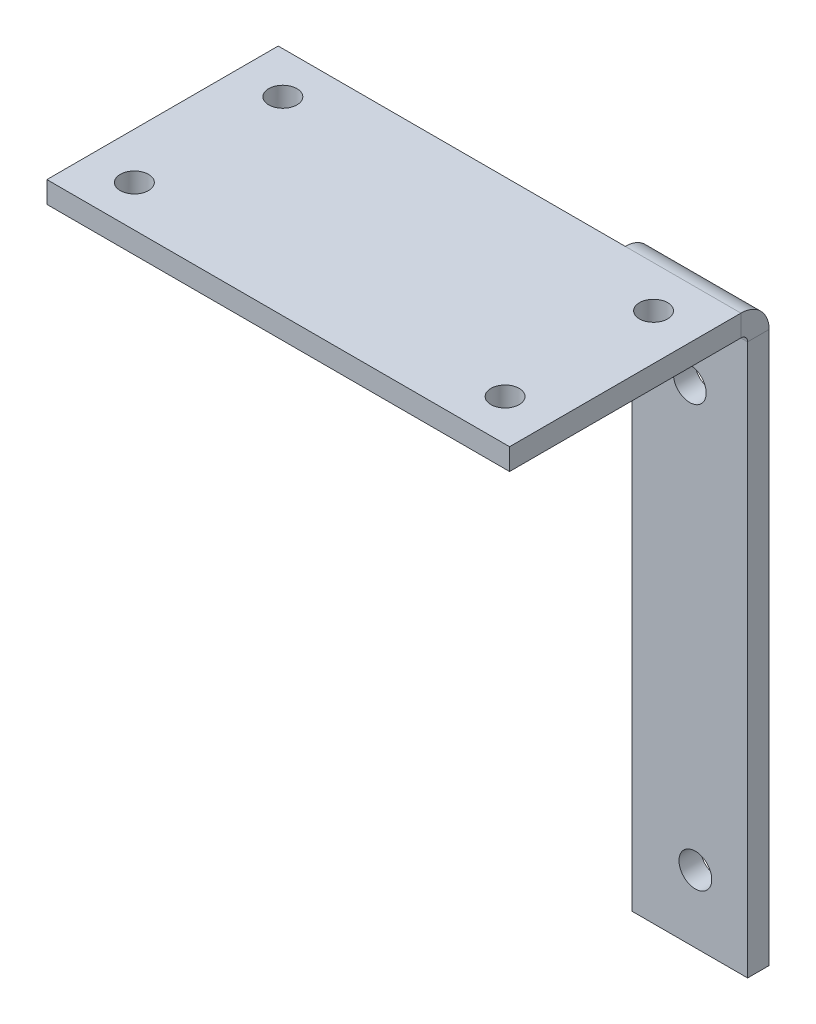
ISO-10303-21;
HEADER;
FILE_DESCRIPTION(('STEP AP214'),'2;1');
FILE_NAME('part.step','',(''),(''),'','','');
FILE_SCHEMA(('AUTOMOTIVE_DESIGN { 1 0 10303 214 1 1 1 1 }'));
ENDSEC;
DATA;
#1=APPLICATION_CONTEXT('core data for automotive mechanical design processes');
#2=APPLICATION_PROTOCOL_DEFINITION('international standard','automotive_design',2000,#1);
#3=PRODUCT_CONTEXT('',#1,'mechanical');
#4=PRODUCT('Part','Part','',(#3));
#5=PRODUCT_RELATED_PRODUCT_CATEGORY('part','',(#4));
#6=PRODUCT_DEFINITION_FORMATION('','',#4);
#7=PRODUCT_DEFINITION_CONTEXT('part definition',#1,'design');
#8=PRODUCT_DEFINITION('design','',#6,#7);
#9=PRODUCT_DEFINITION_SHAPE('','',#8);
#10=(LENGTH_UNIT() NAMED_UNIT(*) SI_UNIT(.MILLI.,.METRE.));
#11=(NAMED_UNIT(*) PLANE_ANGLE_UNIT() SI_UNIT($,.RADIAN.));
#12=(NAMED_UNIT(*) SI_UNIT($,.STERADIAN.) SOLID_ANGLE_UNIT());
#13=UNCERTAINTY_MEASURE_WITH_UNIT(LENGTH_MEASURE(1.E-05),#10,'distance_accuracy_value','');
#14=(GEOMETRIC_REPRESENTATION_CONTEXT(3) GLOBAL_UNCERTAINTY_ASSIGNED_CONTEXT((#13)) GLOBAL_UNIT_ASSIGNED_CONTEXT((#10,
#11,#12)) REPRESENTATION_CONTEXT('',''));
#15=CARTESIAN_POINT('',(0.,0.,0.));
#16=DIRECTION('',(0.,0.,1.));
#17=DIRECTION('',(1.,0.,0.));
#18=AXIS2_PLACEMENT_3D('',#15,#16,#17);
#19=CARTESIAN_POINT('',(0.,25.3135161158946,-28.4988000000001));
#20=DIRECTION('',(0.,0.,1.));
#21=DIRECTION('',(0.,-1.,0.));
#22=AXIS2_PLACEMENT_3D('',#19,#20,#21);
#23=PLANE('',#22);
#24=CARTESIAN_POINT('',(44.45,-10.2464838841054,-28.4988));
#25=DIRECTION('',(0.,0.,-1.));
#26=DIRECTION('',(0.,1.,0.));
#27=AXIS2_PLACEMENT_3D('',#24,#25,#26);
#28=CIRCLE('',#27,1.79958999999999);
#29=CARTESIAN_POINT('',(44.45,-8.44689388410543,-28.4988));
#30=VERTEX_POINT('',#29);
#31=EDGE_CURVE('E166',#30,#30,#28,.T.);
#32=ORIENTED_EDGE('',*,*,#31,.F.);
#33=EDGE_LOOP('',(#32));
#34=FACE_BOUND('',#33,.T.);
#35=CARTESIAN_POINT('',(45.06468,-56.1900038841054,-28.4987999999998));
#36=DIRECTION('',(0.,0.,-1.));
#37=DIRECTION('',(0.,1.,0.));
#38=AXIS2_PLACEMENT_3D('',#35,#36,#37);
#39=CIRCLE('',#38,1.79958999999999);
#40=CARTESIAN_POINT('',(45.06468,-54.3904138841054,-28.4987999999998));
#41=VERTEX_POINT('',#40);
#42=EDGE_CURVE('E165',#41,#41,#39,.T.);
#43=ORIENTED_EDGE('',*,*,#42,.F.);
#44=EDGE_LOOP('',(#43));
#45=FACE_BOUND('',#44,.T.);
#46=DIRECTION('',(0.,1.,0.));
#47=VECTOR('',#46,1.);
#48=CARTESIAN_POINT('',(38.1,-0.0864838841054295,-28.4988));
#49=LINE('',#48,#47);
#50=CARTESIAN_POINT('',(38.1,-63.5864838841054,-28.4987999999998));
#51=VERTEX_POINT('',#50);
#52=CARTESIAN_POINT('',(38.1,-3.09880000000001,-28.4988));
#53=VERTEX_POINT('',#52);
#54=EDGE_CURVE('E60',#51,#53,#49,.T.);
#55=ORIENTED_EDGE('',*,*,#54,.T.);
#56=DIRECTION('',(1.,0.,0.));
#57=VECTOR('',#56,1.);
#58=CARTESIAN_POINT('',(0.,-3.09880000000001,-28.4988));
#59=LINE('',#58,#57);
#60=CARTESIAN_POINT('',(50.8,-3.09880000000001,-28.4988));
#61=VERTEX_POINT('',#60);
#62=EDGE_CURVE('E52',#53,#61,#59,.T.);
#63=ORIENTED_EDGE('',*,*,#62,.T.);
#64=DIRECTION('',(0.,-1.,0.));
#65=VECTOR('',#64,1.);
#66=CARTESIAN_POINT('',(50.8,-63.5864838841054,-28.4987999999998));
#67=LINE('',#66,#65);
#68=CARTESIAN_POINT('',(50.8,-63.5864838841054,-28.4987999999998));
#69=VERTEX_POINT('',#68);
#70=EDGE_CURVE('E68',#61,#69,#67,.T.);
#71=ORIENTED_EDGE('',*,*,#70,.T.);
#72=DIRECTION('',(-1.,0.,0.));
#73=VECTOR('',#72,1.);
#74=CARTESIAN_POINT('',(50.8,-63.5864838841054,-28.4987999999998));
#75=LINE('',#74,#73);
#76=EDGE_CURVE('E178',#69,#51,#75,.T.);
#77=ORIENTED_EDGE('',*,*,#76,.T.);
#78=EDGE_LOOP('',(#55,#63,#71,#77));
#79=FACE_BOUND('',#78,.T.);
#80=ADVANCED_FACE('F43',(#34,#45,#79),#23,.F.);
#81=CARTESIAN_POINT('',(38.1,-0.0864838841054226,-26.1366));
#82=DIRECTION('',(-1.,0.,0.));
#83=DIRECTION('',(0.,1.,0.));
#84=AXIS2_PLACEMENT_3D('',#81,#82,#83);
#85=PLANE('',#84);
#86=DIRECTION('',(0.,0.,1.));
#87=VECTOR('',#86,1.);
#88=CARTESIAN_POINT('',(38.1,-3.0988,-26.1366));
#89=LINE('',#88,#87);
#90=CARTESIAN_POINT('',(38.1,-3.0988,-26.1366));
#91=VERTEX_POINT('',#90);
#92=EDGE_CURVE('E12',#53,#91,#89,.T.);
#93=ORIENTED_EDGE('',*,*,#92,.F.);
#94=ORIENTED_EDGE('',*,*,#54,.F.);
#95=DIRECTION('',(0.,0.,-1.));
#96=VECTOR('',#95,1.);
#97=CARTESIAN_POINT('',(38.1,-63.5864838841054,-26.1365999999998));
#98=LINE('',#97,#96);
#99=CARTESIAN_POINT('',(38.1,-63.5864838841054,-26.1365999999998));
#100=VERTEX_POINT('',#99);
#101=EDGE_CURVE('E180',#100,#51,#98,.T.);
#102=ORIENTED_EDGE('',*,*,#101,.F.);
#103=DIRECTION('',(0.,1.,0.));
#104=VECTOR('',#103,1.);
#105=CARTESIAN_POINT('',(38.1,-0.0864838841054226,-26.1366));
#106=LINE('',#105,#104);
#107=EDGE_CURVE('E177',#100,#91,#106,.T.);
#108=ORIENTED_EDGE('',*,*,#107,.T.);
#109=EDGE_LOOP('',(#93,#94,#102,#108));
#110=FACE_BOUND('',#109,.T.);
#111=ADVANCED_FACE('F45',(#110),#85,.T.);
#112=CARTESIAN_POINT('',(50.8,-63.5864838841054,-26.1365999999998));
#113=DIRECTION('',(0.,-1.,0.));
#114=DIRECTION('',(-1.,0.,0.));
#115=AXIS2_PLACEMENT_3D('',#112,#113,#114);
#116=PLANE('',#115);
#117=ORIENTED_EDGE('',*,*,#76,.F.);
#118=DIRECTION('',(0.,0.,-1.));
#119=VECTOR('',#118,1.);
#120=CARTESIAN_POINT('',(50.8,-63.5864838841054,-26.1365999999998));
#121=LINE('',#120,#119);
#122=CARTESIAN_POINT('',(50.8,-63.5864838841054,-26.1365999999998));
#123=VERTEX_POINT('',#122);
#124=EDGE_CURVE('E183',#123,#69,#121,.T.);
#125=ORIENTED_EDGE('',*,*,#124,.F.);
#126=DIRECTION('',(-1.,0.,0.));
#127=VECTOR('',#126,1.);
#128=CARTESIAN_POINT('',(50.8,-63.5864838841054,-26.1365999999998));
#129=LINE('',#128,#127);
#130=EDGE_CURVE('E174',#123,#100,#129,.T.);
#131=ORIENTED_EDGE('',*,*,#130,.T.);
#132=ORIENTED_EDGE('',*,*,#101,.T.);
#133=EDGE_LOOP('',(#117,#125,#131,#132));
#134=FACE_BOUND('',#133,.T.);
#135=ADVANCED_FACE('F199',(#134),#116,.T.);
#136=CARTESIAN_POINT('',(50.8,-63.5864838841054,-26.1365999999998));
#137=DIRECTION('',(1.,0.,0.));
#138=DIRECTION('',(0.,-1.,0.));
#139=AXIS2_PLACEMENT_3D('',#136,#137,#138);
#140=PLANE('',#139);
#141=DIRECTION('',(0.,0.,-1.));
#142=VECTOR('',#141,1.);
#143=CARTESIAN_POINT('',(50.8,-3.0988,-26.1366));
#144=LINE('',#143,#142);
#145=CARTESIAN_POINT('',(50.8,-3.0988,-26.1366));
#146=VERTEX_POINT('',#145);
#147=EDGE_CURVE('E186',#146,#61,#144,.T.);
#148=ORIENTED_EDGE('',*,*,#147,.F.);
#149=DIRECTION('',(0.,-1.,0.));
#150=VECTOR('',#149,1.);
#151=CARTESIAN_POINT('',(50.8,-63.5864838841054,-26.1365999999998));
#152=LINE('',#151,#150);
#153=EDGE_CURVE('E47',#146,#123,#152,.T.);
#154=ORIENTED_EDGE('',*,*,#153,.T.);
#155=ORIENTED_EDGE('',*,*,#124,.T.);
#156=ORIENTED_EDGE('',*,*,#70,.F.);
#157=EDGE_LOOP('',(#148,#154,#155,#156));
#158=FACE_BOUND('',#157,.T.);
#159=ADVANCED_FACE('F194',(#158),#140,.T.);
#160=CARTESIAN_POINT('',(0.,25.3135161158946,-26.1366000000001));
#161=DIRECTION('',(0.,0.,1.));
#162=DIRECTION('',(0.,-1.,0.));
#163=AXIS2_PLACEMENT_3D('',#160,#161,#162);
#164=PLANE('',#163);
#165=DIRECTION('',(1.,0.,0.));
#166=VECTOR('',#165,1.);
#167=CARTESIAN_POINT('',(0.,-3.0988,-26.1366));
#168=LINE('',#167,#166);
#169=EDGE_CURVE('E182',#91,#146,#168,.T.);
#170=ORIENTED_EDGE('',*,*,#169,.F.);
#171=ORIENTED_EDGE('',*,*,#107,.F.);
#172=ORIENTED_EDGE('',*,*,#130,.F.);
#173=ORIENTED_EDGE('',*,*,#153,.F.);
#174=EDGE_LOOP('',(#170,#171,#172,#173));
#175=FACE_BOUND('',#174,.T.);
#176=CARTESIAN_POINT('',(44.45,-10.2464838841054,-26.1366));
#177=DIRECTION('',(0.,0.,-1.));
#178=DIRECTION('',(0.,1.,0.));
#179=AXIS2_PLACEMENT_3D('',#176,#177,#178);
#180=CIRCLE('',#179,1.79958999999999);
#181=CARTESIAN_POINT('',(44.45,-8.44689388410542,-26.1366));
#182=VERTEX_POINT('',#181);
#183=EDGE_CURVE('E162',#182,#182,#180,.T.);
#184=ORIENTED_EDGE('',*,*,#183,.T.);
#185=EDGE_LOOP('',(#184));
#186=FACE_BOUND('',#185,.T.);
#187=CARTESIAN_POINT('',(45.06468,-56.1900038841054,-26.1365999999998));
#188=DIRECTION('',(0.,0.,-1.));
#189=DIRECTION('',(0.,1.,0.));
#190=AXIS2_PLACEMENT_3D('',#187,#188,#189);
#191=CIRCLE('',#190,1.79958999999999);
#192=CARTESIAN_POINT('',(45.06468,-54.3904138841054,-26.1365999999998));
#193=VERTEX_POINT('',#192);
#194=EDGE_CURVE('E169',#193,#193,#191,.T.);
#195=ORIENTED_EDGE('',*,*,#194,.T.);
#196=EDGE_LOOP('',(#195));
#197=FACE_BOUND('',#196,.T.);
#198=ADVANCED_FACE('F201',(#175,#186,#197),#164,.T.);
#199=CARTESIAN_POINT('',(45.06468,-56.1900038841054,-26.1365999999998));
#200=DIRECTION('',(0.,0.,-1.));
#201=DIRECTION('',(0.,1.,0.));
#202=AXIS2_PLACEMENT_3D('',#199,#200,#201);
#203=CYLINDRICAL_SURFACE('',#202,1.79958999999999);
#204=ORIENTED_EDGE('',*,*,#194,.F.);
#205=EDGE_LOOP('',(#204));
#206=FACE_BOUND('',#205,.T.);
#207=ORIENTED_EDGE('',*,*,#42,.T.);
#208=EDGE_LOOP('',(#207));
#209=FACE_BOUND('',#208,.T.);
#210=ADVANCED_FACE('F268',(#206,#209),#203,.F.);
#211=CARTESIAN_POINT('',(44.45,-10.2464838841054,-26.1366));
#212=DIRECTION('',(0.,0.,-1.));
#213=DIRECTION('',(0.,1.,0.));
#214=AXIS2_PLACEMENT_3D('',#211,#212,#213);
#215=CYLINDRICAL_SURFACE('',#214,1.79958999999999);
#216=ORIENTED_EDGE('',*,*,#183,.F.);
#217=EDGE_LOOP('',(#216));
#218=FACE_BOUND('',#217,.T.);
#219=ORIENTED_EDGE('',*,*,#31,.T.);
#220=EDGE_LOOP('',(#219));
#221=FACE_BOUND('',#220,.T.);
#222=ADVANCED_FACE('F254',(#218,#221),#215,.F.);
#223=CARTESIAN_POINT('',(0.,-2.3622,0.));
#224=DIRECTION('',(-1.,0.,0.));
#225=DIRECTION('',(0.,0.,1.));
#226=AXIS2_PLACEMENT_3D('',#223,#224,#225);
#227=PLANE('',#226);
#228=DIRECTION('',(0.,0.,1.));
#229=VECTOR('',#228,1.);
#230=CARTESIAN_POINT('',(0.,0.,0.));
#231=LINE('',#230,#229);
#232=CARTESIAN_POINT('',(0.,0.,-25.4));
#233=VERTEX_POINT('',#232);
#234=CARTESIAN_POINT('',(0.,0.,0.));
#235=VERTEX_POINT('',#234);
#236=EDGE_CURVE('E222',#233,#235,#231,.T.);
#237=ORIENTED_EDGE('',*,*,#236,.F.);
#238=DIRECTION('',(0.,1.,0.));
#239=VECTOR('',#238,1.);
#240=CARTESIAN_POINT('',(0.,-2.3622,-25.4));
#241=LINE('',#240,#239);
#242=CARTESIAN_POINT('',(0.,-2.3622,-25.4));
#243=VERTEX_POINT('',#242);
#244=EDGE_CURVE('E148',#243,#233,#241,.T.);
#245=ORIENTED_EDGE('',*,*,#244,.F.);
#246=DIRECTION('',(0.,0.,1.));
#247=VECTOR('',#246,1.);
#248=CARTESIAN_POINT('',(0.,-2.3622,0.));
#249=LINE('',#248,#247);
#250=CARTESIAN_POINT('',(0.,-2.3622,0.));
#251=VERTEX_POINT('',#250);
#252=EDGE_CURVE('E146',#243,#251,#249,.T.);
#253=ORIENTED_EDGE('',*,*,#252,.T.);
#254=DIRECTION('',(0.,1.,0.));
#255=VECTOR('',#254,1.);
#256=CARTESIAN_POINT('',(0.,-2.3622,0.));
#257=LINE('',#256,#255);
#258=EDGE_CURVE('E234',#251,#235,#257,.T.);
#259=ORIENTED_EDGE('',*,*,#258,.T.);
#260=EDGE_LOOP('',(#237,#245,#253,#259));
#261=FACE_BOUND('',#260,.T.);
#262=ADVANCED_FACE('F237',(#261),#227,.T.);
#263=CARTESIAN_POINT('',(0.,-2.3622,0.));
#264=DIRECTION('',(0.,0.,1.));
#265=DIRECTION('',(1.,0.,0.));
#266=AXIS2_PLACEMENT_3D('',#263,#264,#265);
#267=PLANE('',#266);
#268=DIRECTION('',(1.,0.,0.));
#269=VECTOR('',#268,1.);
#270=CARTESIAN_POINT('',(0.,0.,0.));
#271=LINE('',#270,#269);
#272=CARTESIAN_POINT('',(50.8,0.,0.));
#273=VERTEX_POINT('',#272);
#274=EDGE_CURVE('E219',#235,#273,#271,.T.);
#275=ORIENTED_EDGE('',*,*,#274,.F.);
#276=ORIENTED_EDGE('',*,*,#258,.F.);
#277=DIRECTION('',(1.,0.,0.));
#278=VECTOR('',#277,1.);
#279=CARTESIAN_POINT('',(0.,-2.3622,0.));
#280=LINE('',#279,#278);
#281=CARTESIAN_POINT('',(50.8,-2.3622,0.));
#282=VERTEX_POINT('',#281);
#283=EDGE_CURVE('E231',#251,#282,#280,.T.);
#284=ORIENTED_EDGE('',*,*,#283,.T.);
#285=DIRECTION('',(0.,1.,0.));
#286=VECTOR('',#285,1.);
#287=CARTESIAN_POINT('',(50.8,-2.3622,0.));
#288=LINE('',#287,#286);
#289=EDGE_CURVE('E138',#282,#273,#288,.T.);
#290=ORIENTED_EDGE('',*,*,#289,.T.);
#291=EDGE_LOOP('',(#275,#276,#284,#290));
#292=FACE_BOUND('',#291,.T.);
#293=ADVANCED_FACE('F245',(#292),#267,.T.);
#294=CARTESIAN_POINT('',(0.,-2.3622,0.));
#295=DIRECTION('',(0.,-1.,0.));
#296=DIRECTION('',(0.,0.,-1.));
#297=AXIS2_PLACEMENT_3D('',#294,#295,#296);
#298=PLANE('',#297);
#299=CARTESIAN_POINT('',(5.08,-2.3622,-20.828));
#300=DIRECTION('',(0.,-1.,0.));
#301=DIRECTION('',(0.,0.,-1.));
#302=AXIS2_PLACEMENT_3D('',#299,#300,#301);
#303=CIRCLE('',#302,1.54999999999999);
#304=CARTESIAN_POINT('',(5.08,-2.3622,-22.378));
#305=VERTEX_POINT('',#304);
#306=EDGE_CURVE('E474',#305,#305,#303,.F.);
#307=ORIENTED_EDGE('',*,*,#306,.T.);
#308=EDGE_LOOP('',(#307));
#309=FACE_BOUND('',#308,.T.);
#310=CARTESIAN_POINT('',(45.78,-2.3622,-4.52800000000005));
#311=DIRECTION('',(0.,-1.,0.));
#312=DIRECTION('',(0.,0.,-1.));
#313=AXIS2_PLACEMENT_3D('',#310,#311,#312);
#314=CIRCLE('',#313,1.54999999999999);
#315=CARTESIAN_POINT('',(45.78,-2.3622,-6.07800000000004));
#316=VERTEX_POINT('',#315);
#317=EDGE_CURVE('E478',#316,#316,#314,.F.);
#318=ORIENTED_EDGE('',*,*,#317,.T.);
#319=EDGE_LOOP('',(#318));
#320=FACE_BOUND('',#319,.T.);
#321=CARTESIAN_POINT('',(5.08,-2.3622,-4.52800000000005));
#322=DIRECTION('',(0.,-1.,0.));
#323=DIRECTION('',(0.,0.,-1.));
#324=AXIS2_PLACEMENT_3D('',#321,#322,#323);
#325=CIRCLE('',#324,1.54999999999999);
#326=CARTESIAN_POINT('',(5.08,-2.3622,-6.07800000000004));
#327=VERTEX_POINT('',#326);
#328=EDGE_CURVE('E490',#327,#327,#325,.F.);
#329=ORIENTED_EDGE('',*,*,#328,.T.);
#330=EDGE_LOOP('',(#329));
#331=FACE_BOUND('',#330,.T.);
#332=CARTESIAN_POINT('',(45.78,-2.3622,-20.8280000000001));
#333=DIRECTION('',(0.,-1.,0.));
#334=DIRECTION('',(0.,0.,-1.));
#335=AXIS2_PLACEMENT_3D('',#332,#333,#334);
#336=CIRCLE('',#335,1.54999999999999);
#337=CARTESIAN_POINT('',(45.78,-2.3622,-22.378));
#338=VERTEX_POINT('',#337);
#339=EDGE_CURVE('E489',#338,#338,#336,.F.);
#340=ORIENTED_EDGE('',*,*,#339,.T.);
#341=EDGE_LOOP('',(#340));
#342=FACE_BOUND('',#341,.T.);
#343=DIRECTION('',(-1.,0.,0.));
#344=VECTOR('',#343,1.);
#345=CARTESIAN_POINT('',(0.,-2.3622,-25.4));
#346=LINE('',#345,#344);
#347=CARTESIAN_POINT('',(38.1,-2.3622,-25.4));
#348=VERTEX_POINT('',#347);
#349=EDGE_CURVE('E142',#348,#243,#346,.T.);
#350=ORIENTED_EDGE('',*,*,#349,.F.);
#351=DIRECTION('',(1.,0.,0.));
#352=VECTOR('',#351,1.);
#353=CARTESIAN_POINT('',(0.,-2.3622,-25.4));
#354=LINE('',#353,#352);
#355=CARTESIAN_POINT('',(50.8,-2.3622,-25.4));
#356=VERTEX_POINT('',#355);
#357=EDGE_CURVE('E130',#348,#356,#354,.T.);
#358=ORIENTED_EDGE('',*,*,#357,.T.);
#359=DIRECTION('',(0.,0.,-1.));
#360=VECTOR('',#359,1.);
#361=CARTESIAN_POINT('',(50.8,-2.3622,-88.9));
#362=LINE('',#361,#360);
#363=EDGE_CURVE('E137',#282,#356,#362,.T.);
#364=ORIENTED_EDGE('',*,*,#363,.F.);
#365=ORIENTED_EDGE('',*,*,#283,.F.);
#366=ORIENTED_EDGE('',*,*,#252,.F.);
#367=EDGE_LOOP('',(#350,#358,#364,#365,#366));
#368=FACE_BOUND('',#367,.T.);
#369=ADVANCED_FACE('F143',(#309,#320,#331,#342,#368),#298,.T.);
#370=CARTESIAN_POINT('',(50.8,-2.3622,-88.9));
#371=DIRECTION('',(1.,0.,0.));
#372=DIRECTION('',(0.,0.,-1.));
#373=AXIS2_PLACEMENT_3D('',#370,#371,#372);
#374=PLANE('',#373);
#375=ORIENTED_EDGE('',*,*,#363,.T.);
#376=DIRECTION('',(0.,1.,0.));
#377=VECTOR('',#376,1.);
#378=CARTESIAN_POINT('',(50.8,-2.3622,-25.4));
#379=LINE('',#378,#377);
#380=CARTESIAN_POINT('',(50.8,0.,-25.4));
#381=VERTEX_POINT('',#380);
#382=EDGE_CURVE('E226',#356,#381,#379,.T.);
#383=ORIENTED_EDGE('',*,*,#382,.T.);
#384=DIRECTION('',(0.,0.,-1.));
#385=VECTOR('',#384,1.);
#386=CARTESIAN_POINT('',(50.8,0.,-88.9));
#387=LINE('',#386,#385);
#388=EDGE_CURVE('E149',#273,#381,#387,.T.);
#389=ORIENTED_EDGE('',*,*,#388,.F.);
#390=ORIENTED_EDGE('',*,*,#289,.F.);
#391=EDGE_LOOP('',(#375,#383,#389,#390));
#392=FACE_BOUND('',#391,.T.);
#393=ADVANCED_FACE('F243',(#392),#374,.T.);
#394=CARTESIAN_POINT('',(0.,0.,0.));
#395=DIRECTION('',(0.,-1.,0.));
#396=DIRECTION('',(0.,0.,-1.));
#397=AXIS2_PLACEMENT_3D('',#394,#395,#396);
#398=PLANE('',#397);
#399=CARTESIAN_POINT('',(5.08,0.,-20.828));
#400=DIRECTION('',(0.,1.,0.));
#401=DIRECTION('',(0.,0.,1.));
#402=AXIS2_PLACEMENT_3D('',#399,#400,#401);
#403=CIRCLE('',#402,1.54999999999999);
#404=CARTESIAN_POINT('',(5.08,0.,-19.278));
#405=VERTEX_POINT('',#404);
#406=EDGE_CURVE('E477',#405,#405,#403,.T.);
#407=ORIENTED_EDGE('',*,*,#406,.F.);
#408=EDGE_LOOP('',(#407));
#409=FACE_BOUND('',#408,.T.);
#410=CARTESIAN_POINT('',(45.78,0.,-4.52800000000005));
#411=DIRECTION('',(0.,1.,0.));
#412=DIRECTION('',(0.,0.,1.));
#413=AXIS2_PLACEMENT_3D('',#410,#411,#412);
#414=CIRCLE('',#413,1.54999999999999);
#415=CARTESIAN_POINT('',(45.78,0.,-2.97800000000006));
#416=VERTEX_POINT('',#415);
#417=EDGE_CURVE('E481',#416,#416,#414,.T.);
#418=ORIENTED_EDGE('',*,*,#417,.F.);
#419=EDGE_LOOP('',(#418));
#420=FACE_BOUND('',#419,.T.);
#421=CARTESIAN_POINT('',(5.08,0.,-4.52800000000005));
#422=DIRECTION('',(0.,1.,0.));
#423=DIRECTION('',(0.,0.,1.));
#424=AXIS2_PLACEMENT_3D('',#421,#422,#423);
#425=CIRCLE('',#424,1.54999999999999);
#426=CARTESIAN_POINT('',(5.08,0.,-2.97800000000006));
#427=VERTEX_POINT('',#426);
#428=EDGE_CURVE('E486',#427,#427,#425,.T.);
#429=ORIENTED_EDGE('',*,*,#428,.F.);
#430=EDGE_LOOP('',(#429));
#431=FACE_BOUND('',#430,.T.);
#432=CARTESIAN_POINT('',(45.78,0.,-20.8280000000001));
#433=DIRECTION('',(0.,1.,0.));
#434=DIRECTION('',(0.,0.,1.));
#435=AXIS2_PLACEMENT_3D('',#432,#433,#434);
#436=CIRCLE('',#435,1.54999999999999);
#437=CARTESIAN_POINT('',(45.78,0.,-19.2780000000001));
#438=VERTEX_POINT('',#437);
#439=EDGE_CURVE('E214',#438,#438,#436,.T.);
#440=ORIENTED_EDGE('',*,*,#439,.F.);
#441=EDGE_LOOP('',(#440));
#442=FACE_BOUND('',#441,.T.);
#443=DIRECTION('',(1.,0.,0.));
#444=VECTOR('',#443,1.);
#445=CARTESIAN_POINT('',(0.,0.,-25.4));
#446=LINE('',#445,#444);
#447=CARTESIAN_POINT('',(38.1,0.,-25.4));
#448=VERTEX_POINT('',#447);
#449=EDGE_CURVE('E156',#448,#381,#446,.T.);
#450=ORIENTED_EDGE('',*,*,#449,.F.);
#451=DIRECTION('',(-1.,0.,0.));
#452=VECTOR('',#451,1.);
#453=CARTESIAN_POINT('',(0.,0.,-25.4));
#454=LINE('',#453,#452);
#455=EDGE_CURVE('E154',#448,#233,#454,.T.);
#456=ORIENTED_EDGE('',*,*,#455,.T.);
#457=ORIENTED_EDGE('',*,*,#236,.T.);
#458=ORIENTED_EDGE('',*,*,#274,.T.);
#459=ORIENTED_EDGE('',*,*,#388,.T.);
#460=EDGE_LOOP('',(#450,#456,#457,#458,#459));
#461=FACE_BOUND('',#460,.T.);
#462=ADVANCED_FACE('F240',(#409,#420,#431,#442,#461),#398,.F.);
#463=CARTESIAN_POINT('',(0.,-2.3622,-25.4));
#464=DIRECTION('',(0.,0.,-1.));
#465=DIRECTION('',(-1.,0.,0.));
#466=AXIS2_PLACEMENT_3D('',#463,#464,#465);
#467=PLANE('',#466);
#468=ORIENTED_EDGE('',*,*,#455,.F.);
#469=DIRECTION('',(0.,1.,0.));
#470=VECTOR('',#469,1.);
#471=CARTESIAN_POINT('',(38.1,-2.3622,-25.4));
#472=LINE('',#471,#470);
#473=EDGE_CURVE('E121',#348,#448,#472,.T.);
#474=ORIENTED_EDGE('',*,*,#473,.F.);
#475=ORIENTED_EDGE('',*,*,#349,.T.);
#476=ORIENTED_EDGE('',*,*,#244,.T.);
#477=EDGE_LOOP('',(#468,#474,#475,#476));
#478=FACE_BOUND('',#477,.T.);
#479=ADVANCED_FACE('F152',(#478),#467,.T.);
#480=CARTESIAN_POINT('',(38.1,-3.0988,-25.4));
#481=DIRECTION('',(1.,0.,0.));
#482=DIRECTION('',(0.,0.,-1.));
#483=AXIS2_PLACEMENT_3D('',#480,#481,#482);
#484=PLANE('',#483);
#485=ORIENTED_EDGE('',*,*,#473,.T.);
#486=CARTESIAN_POINT('',(38.1,-3.0988,-25.4));
#487=DIRECTION('',(1.,0.,0.));
#488=DIRECTION('',(0.,0.,-1.));
#489=AXIS2_PLACEMENT_3D('',#486,#487,#488);
#490=CIRCLE('',#489,3.0988);
#491=EDGE_CURVE('E212',#448,#53,#490,.F.);
#492=ORIENTED_EDGE('',*,*,#491,.T.);
#493=ORIENTED_EDGE('',*,*,#92,.T.);
#494=CARTESIAN_POINT('',(38.1,-3.0988,-25.4));
#495=DIRECTION('',(-1.,0.,0.));
#496=DIRECTION('',(0.,0.,-1.));
#497=AXIS2_PLACEMENT_3D('',#494,#495,#496);
#498=CIRCLE('',#497,0.7366);
#499=EDGE_CURVE('E116',#348,#91,#498,.T.);
#500=ORIENTED_EDGE('',*,*,#499,.F.);
#501=EDGE_LOOP('',(#485,#492,#493,#500));
#502=FACE_BOUND('',#501,.T.);
#503=ADVANCED_FACE('F118',(#502),#484,.F.);
#504=CARTESIAN_POINT('',(50.8,-3.0988,-25.4));
#505=DIRECTION('',(-1.,0.,0.));
#506=DIRECTION('',(0.,0.,1.));
#507=AXIS2_PLACEMENT_3D('',#504,#505,#506);
#508=PLANE('',#507);
#509=ORIENTED_EDGE('',*,*,#147,.T.);
#510=CARTESIAN_POINT('',(50.8,-3.0988,-25.4));
#511=DIRECTION('',(1.,0.,0.));
#512=DIRECTION('',(0.,0.,-1.));
#513=AXIS2_PLACEMENT_3D('',#510,#511,#512);
#514=CIRCLE('',#513,3.0988);
#515=EDGE_CURVE('E126',#61,#381,#514,.T.);
#516=ORIENTED_EDGE('',*,*,#515,.T.);
#517=ORIENTED_EDGE('',*,*,#382,.F.);
#518=CARTESIAN_POINT('',(50.8,-3.0988,-25.4));
#519=DIRECTION('',(1.,0.,0.));
#520=DIRECTION('',(0.,0.,1.));
#521=AXIS2_PLACEMENT_3D('',#518,#519,#520);
#522=CIRCLE('',#521,0.7366);
#523=EDGE_CURVE('E125',#146,#356,#522,.T.);
#524=ORIENTED_EDGE('',*,*,#523,.F.);
#525=EDGE_LOOP('',(#509,#516,#517,#524));
#526=FACE_BOUND('',#525,.T.);
#527=ADVANCED_FACE('F209',(#526),#508,.F.);
#528=CARTESIAN_POINT('',(31.1856101828211,-3.0988,-25.4));
#529=DIRECTION('',(1.,0.,0.));
#530=DIRECTION('',(0.,0.,-1.));
#531=AXIS2_PLACEMENT_3D('',#528,#529,#530);
#532=CYLINDRICAL_SURFACE('',#531,0.7366);
#533=ORIENTED_EDGE('',*,*,#523,.T.);
#534=ORIENTED_EDGE('',*,*,#357,.F.);
#535=ORIENTED_EDGE('',*,*,#499,.T.);
#536=ORIENTED_EDGE('',*,*,#169,.T.);
#537=EDGE_LOOP('',(#533,#534,#535,#536));
#538=FACE_BOUND('',#537,.T.);
#539=ADVANCED_FACE('F132',(#538),#532,.F.);
#540=CARTESIAN_POINT('',(31.1856101828211,-3.0988,-25.4));
#541=DIRECTION('',(1.,0.,0.));
#542=DIRECTION('',(0.,0.,-1.));
#543=AXIS2_PLACEMENT_3D('',#540,#541,#542);
#544=CYLINDRICAL_SURFACE('',#543,3.0988);
#545=ORIENTED_EDGE('',*,*,#515,.F.);
#546=ORIENTED_EDGE('',*,*,#62,.F.);
#547=ORIENTED_EDGE('',*,*,#491,.F.);
#548=ORIENTED_EDGE('',*,*,#449,.T.);
#549=EDGE_LOOP('',(#545,#546,#547,#548));
#550=FACE_BOUND('',#549,.T.);
#551=ADVANCED_FACE('F211',(#550),#544,.T.);
#552=CARTESIAN_POINT('',(45.78,-63.5874838841054,-20.8280000000001));
#553=DIRECTION('',(0.,1.,0.));
#554=DIRECTION('',(0.,0.,1.));
#555=AXIS2_PLACEMENT_3D('',#552,#553,#554);
#556=CYLINDRICAL_SURFACE('',#555,1.54999999999999);
#557=ORIENTED_EDGE('',*,*,#339,.F.);
#558=EDGE_LOOP('',(#557));
#559=FACE_BOUND('',#558,.T.);
#560=ORIENTED_EDGE('',*,*,#439,.T.);
#561=EDGE_LOOP('',(#560));
#562=FACE_BOUND('',#561,.T.);
#563=ADVANCED_FACE('F320',(#559,#562),#556,.F.);
#564=CARTESIAN_POINT('',(5.08,-63.5874838841054,-4.52800000000005));
#565=DIRECTION('',(0.,1.,0.));
#566=DIRECTION('',(0.,0.,1.));
#567=AXIS2_PLACEMENT_3D('',#564,#565,#566);
#568=CYLINDRICAL_SURFACE('',#567,1.54999999999999);
#569=ORIENTED_EDGE('',*,*,#328,.F.);
#570=EDGE_LOOP('',(#569));
#571=FACE_BOUND('',#570,.T.);
#572=ORIENTED_EDGE('',*,*,#428,.T.);
#573=EDGE_LOOP('',(#572));
#574=FACE_BOUND('',#573,.T.);
#575=ADVANCED_FACE('F326',(#571,#574),#568,.F.);
#576=CARTESIAN_POINT('',(45.78,-63.5874838841054,-4.52800000000005));
#577=DIRECTION('',(0.,1.,0.));
#578=DIRECTION('',(0.,0.,1.));
#579=AXIS2_PLACEMENT_3D('',#576,#577,#578);
#580=CYLINDRICAL_SURFACE('',#579,1.54999999999999);
#581=ORIENTED_EDGE('',*,*,#317,.F.);
#582=EDGE_LOOP('',(#581));
#583=FACE_BOUND('',#582,.T.);
#584=ORIENTED_EDGE('',*,*,#417,.T.);
#585=EDGE_LOOP('',(#584));
#586=FACE_BOUND('',#585,.T.);
#587=ADVANCED_FACE('F334',(#583,#586),#580,.F.);
#588=CARTESIAN_POINT('',(5.08,-63.5874838841054,-20.828));
#589=DIRECTION('',(0.,1.,0.));
#590=DIRECTION('',(0.,0.,1.));
#591=AXIS2_PLACEMENT_3D('',#588,#589,#590);
#592=CYLINDRICAL_SURFACE('',#591,1.54999999999999);
#593=ORIENTED_EDGE('',*,*,#306,.F.);
#594=EDGE_LOOP('',(#593));
#595=FACE_BOUND('',#594,.T.);
#596=ORIENTED_EDGE('',*,*,#406,.T.);
#597=EDGE_LOOP('',(#596));
#598=FACE_BOUND('',#597,.T.);
#599=ADVANCED_FACE('F342',(#595,#598),#592,.F.);
#600=CLOSED_SHELL('',(#80,#111,#135,#159,#198,#210,#222,#262,#293,#369,#393,#462,#479,#503,#527,
#539,#551,#563,#575,#587,#599));
#601=MANIFOLD_SOLID_BREP('B2',#600);
#602=ADVANCED_BREP_SHAPE_REPRESENTATION('',(#18,#601),#14);
#603=SHAPE_DEFINITION_REPRESENTATION(#9,#602);
ENDSEC;
END-ISO-10303-21;
